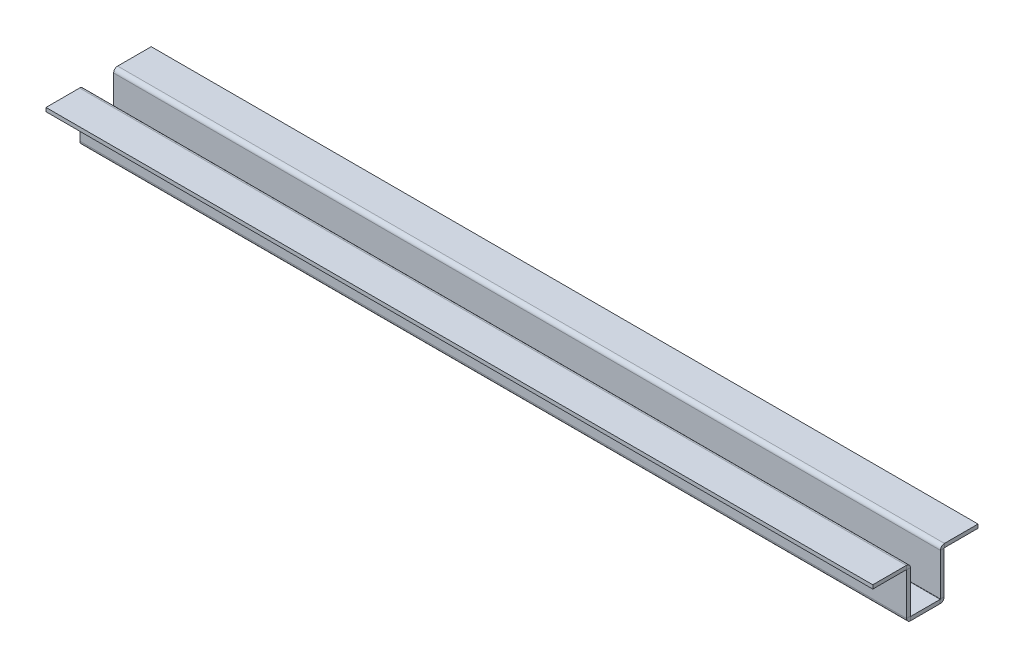
ISO-10303-21;
HEADER;
FILE_DESCRIPTION(('STEP AP214'),'2;1');
FILE_NAME('part.step','',(''),(''),'','','');
FILE_SCHEMA(('AUTOMOTIVE_DESIGN { 1 0 10303 214 1 1 1 1 }'));
ENDSEC;
DATA;
#1=APPLICATION_CONTEXT('core data for automotive mechanical design processes');
#2=APPLICATION_PROTOCOL_DEFINITION('international standard','automotive_design',2000,#1);
#3=PRODUCT_CONTEXT('',#1,'mechanical');
#4=PRODUCT('Part','Part','',(#3));
#5=PRODUCT_RELATED_PRODUCT_CATEGORY('part','',(#4));
#6=PRODUCT_DEFINITION_FORMATION('','',#4);
#7=PRODUCT_DEFINITION_CONTEXT('part definition',#1,'design');
#8=PRODUCT_DEFINITION('design','',#6,#7);
#9=PRODUCT_DEFINITION_SHAPE('','',#8);
#10=(LENGTH_UNIT() NAMED_UNIT(*) SI_UNIT(.MILLI.,.METRE.));
#11=(NAMED_UNIT(*) PLANE_ANGLE_UNIT() SI_UNIT($,.RADIAN.));
#12=(NAMED_UNIT(*) SI_UNIT($,.STERADIAN.) SOLID_ANGLE_UNIT());
#13=UNCERTAINTY_MEASURE_WITH_UNIT(LENGTH_MEASURE(1.E-05),#10,'distance_accuracy_value','');
#14=(GEOMETRIC_REPRESENTATION_CONTEXT(3) GLOBAL_UNCERTAINTY_ASSIGNED_CONTEXT((#13)) GLOBAL_UNIT_ASSIGNED_CONTEXT((#10,
#11,#12)) REPRESENTATION_CONTEXT('',''));
#15=CARTESIAN_POINT('',(0.,0.,0.));
#16=DIRECTION('',(0.,0.,1.));
#17=DIRECTION('',(1.,0.,0.));
#18=AXIS2_PLACEMENT_3D('',#15,#16,#17);
#19=CARTESIAN_POINT('',(-31.518813398457,-920.54389710299,748.999999999992));
#20=DIRECTION('',(0.,0.,1.));
#21=DIRECTION('',(1.,0.,0.));
#22=AXIS2_PLACEMENT_3D('',#19,#20,#21);
#23=PLANE('',#22);
#24=DIRECTION('',(1.,0.,0.));
#25=VECTOR('',#24,1.);
#26=CARTESIAN_POINT('',(-1.88320096237854E-12,-260.,748.999999999993));
#27=LINE('',#26,#25);
#28=CARTESIAN_POINT('',(14.9999999999995,-260.,748.999999999993));
#29=VERTEX_POINT('',#28);
#30=CARTESIAN_POINT('',(345.000000000001,-260.000000000003,749.));
#31=VERTEX_POINT('',#30);
#32=EDGE_CURVE('E450',#29,#31,#27,.T.);
#33=ORIENTED_EDGE('',*,*,#32,.T.);
#34=DIRECTION('',(0.,1.,0.));
#35=VECTOR('',#34,1.);
#36=CARTESIAN_POINT('',(344.999999999996,-920.54389710299,749.));
#37=LINE('',#36,#35);
#38=CARTESIAN_POINT('',(345.000000000001,-261.500000000003,749.));
#39=VERTEX_POINT('',#38);
#40=EDGE_CURVE('E438',#39,#31,#37,.T.);
#41=ORIENTED_EDGE('',*,*,#40,.F.);
#42=DIRECTION('',(1.,0.,0.));
#43=VECTOR('',#42,1.);
#44=CARTESIAN_POINT('',(-31.5188133984515,-261.5,748.999999999992));
#45=LINE('',#44,#43);
#46=CARTESIAN_POINT('',(14.9999999999995,-261.500000000004,748.999999999993));
#47=VERTEX_POINT('',#46);
#48=EDGE_CURVE('E12',#47,#39,#45,.T.);
#49=ORIENTED_EDGE('',*,*,#48,.F.);
#50=DIRECTION('',(0.,1.,0.));
#51=VECTOR('',#50,1.);
#52=CARTESIAN_POINT('',(14.9999999999939,-920.543897102993,748.999999999993));
#53=LINE('',#52,#51);
#54=EDGE_CURVE('E447',#47,#29,#53,.T.);
#55=ORIENTED_EDGE('',*,*,#54,.T.);
#56=EDGE_LOOP('',(#33,#41,#49,#55));
#57=FACE_BOUND('',#56,.T.);
#58=ADVANCED_FACE('F54',(#57),#23,.F.);
#59=CARTESIAN_POINT('',(15.0000000000086,-920.543897102994,15.7071067811791));
#60=DIRECTION('',(-1.,0.,0.));
#61=DIRECTION('',(0.,0.,1.));
#62=AXIS2_PLACEMENT_3D('',#59,#60,#61);
#63=PLANE('',#62);
#64=DIRECTION('',(0.,1.,0.));
#65=VECTOR('',#64,1.);
#66=CARTESIAN_POINT('',(14.9999999999937,-920.543897102994,762.399999999997));
#67=LINE('',#66,#65);
#68=CARTESIAN_POINT('',(14.9999999999992,-261.500000000004,762.399999999997));
#69=VERTEX_POINT('',#68);
#70=CARTESIAN_POINT('',(14.9999999999991,-260.000000000001,762.399999999997));
#71=VERTEX_POINT('',#70);
#72=EDGE_CURVE('E444',#69,#71,#67,.T.);
#73=ORIENTED_EDGE('',*,*,#72,.T.);
#74=DIRECTION('',(0.,0.,1.));
#75=VECTOR('',#74,1.);
#76=CARTESIAN_POINT('',(15.0000000000145,-260.,-6.66133814775094E-12));
#77=LINE('',#76,#75);
#78=EDGE_CURVE('E439',#71,#29,#77,.F.);
#79=ORIENTED_EDGE('',*,*,#78,.T.);
#80=ORIENTED_EDGE('',*,*,#54,.F.);
#81=DIRECTION('',(0.,0.,1.));
#82=VECTOR('',#81,1.);
#83=CARTESIAN_POINT('',(15.0000000000142,-261.500000000004,15.7071067811791));
#84=LINE('',#83,#82);
#85=EDGE_CURVE('E432',#47,#69,#84,.T.);
#86=ORIENTED_EDGE('',*,*,#85,.T.);
#87=EDGE_LOOP('',(#73,#79,#80,#86));
#88=FACE_BOUND('',#87,.T.);
#89=ADVANCED_FACE('F646',(#88),#63,.T.);
#90=CARTESIAN_POINT('',(14.9999999999987,-260.,790.999999999993));
#91=DIRECTION('',(0.,1.,0.));
#92=DIRECTION('',(-1.,0.,0.));
#93=AXIS2_PLACEMENT_3D('',#90,#91,#92);
#94=PLANE('',#93);
#95=DIRECTION('',(-1.,0.,0.));
#96=VECTOR('',#95,1.);
#97=CARTESIAN_POINT('',(14.9999999999993,-260.,762.399999999997));
#98=LINE('',#97,#96);
#99=CARTESIAN_POINT('',(345.000000000001,-260.000000000003,762.4));
#100=VERTEX_POINT('',#99);
#101=EDGE_CURVE('E110',#100,#71,#98,.T.);
#102=ORIENTED_EDGE('',*,*,#101,.F.);
#103=DIRECTION('',(0.,0.,1.));
#104=VECTOR('',#103,1.);
#105=CARTESIAN_POINT('',(345.000000000016,-260.000000000003,0.));
#106=LINE('',#105,#104);
#107=EDGE_CURVE('E102',#31,#100,#106,.T.);
#108=ORIENTED_EDGE('',*,*,#107,.F.);
#109=ORIENTED_EDGE('',*,*,#32,.F.);
#110=ORIENTED_EDGE('',*,*,#78,.F.);
#111=EDGE_LOOP('',(#102,#108,#109,#110));
#112=FACE_BOUND('',#111,.T.);
#113=ADVANCED_FACE('F652',(#112),#94,.T.);
#114=CARTESIAN_POINT('',(345.00000000001,-920.54389710299,15.7071067811856));
#115=DIRECTION('',(1.,0.,0.));
#116=DIRECTION('',(0.,0.,-1.));
#117=AXIS2_PLACEMENT_3D('',#114,#115,#116);
#118=PLANE('',#117);
#119=ORIENTED_EDGE('',*,*,#40,.T.);
#120=ORIENTED_EDGE('',*,*,#107,.T.);
#121=DIRECTION('',(0.,1.,0.));
#122=VECTOR('',#121,1.);
#123=CARTESIAN_POINT('',(344.999999999995,-920.54389710299,762.4));
#124=LINE('',#123,#122);
#125=CARTESIAN_POINT('',(345.000000000001,-261.5,762.4));
#126=VERTEX_POINT('',#125);
#127=EDGE_CURVE('E280',#126,#100,#124,.T.);
#128=ORIENTED_EDGE('',*,*,#127,.F.);
#129=DIRECTION('',(0.,0.,-1.));
#130=VECTOR('',#129,1.);
#131=CARTESIAN_POINT('',(345.000000000016,-261.500000000003,15.7071067811856));
#132=LINE('',#131,#130);
#133=EDGE_CURVE('E67',#126,#39,#132,.T.);
#134=ORIENTED_EDGE('',*,*,#133,.T.);
#135=EDGE_LOOP('',(#119,#120,#128,#134));
#136=FACE_BOUND('',#135,.T.);
#137=ADVANCED_FACE('F663',(#136),#118,.T.);
#138=CARTESIAN_POINT('',(1.30834004829127E-11,-261.5,-6.99440505513849E-12));
#139=DIRECTION('',(0.,-1.,0.));
#140=DIRECTION('',(1.,0.,0.));
#141=AXIS2_PLACEMENT_3D('',#138,#139,#140);
#142=PLANE('',#141);
#143=DIRECTION('',(1.,0.,0.));
#144=VECTOR('',#143,1.);
#145=CARTESIAN_POINT('',(14.9999999999993,-261.5,762.399999999997));
#146=LINE('',#145,#144);
#147=EDGE_CURVE('E59',#69,#126,#146,.T.);
#148=ORIENTED_EDGE('',*,*,#147,.F.);
#149=ORIENTED_EDGE('',*,*,#85,.F.);
#150=ORIENTED_EDGE('',*,*,#48,.T.);
#151=ORIENTED_EDGE('',*,*,#133,.F.);
#152=EDGE_LOOP('',(#148,#149,#150,#151));
#153=FACE_BOUND('',#152,.T.);
#154=ADVANCED_FACE('F57',(#153),#142,.T.);
#155=CARTESIAN_POINT('',(-31.5188133984564,-920.543897102991,791.000000000006));
#156=DIRECTION('',(0.,0.,-1.));
#157=DIRECTION('',(-1.,0.,0.));
#158=AXIS2_PLACEMENT_3D('',#155,#156,#157);
#159=PLANE('',#158);
#160=DIRECTION('',(1.,0.,0.));
#161=VECTOR('',#160,1.);
#162=CARTESIAN_POINT('',(-1.57900314343364E-12,-260.,791.000000000005));
#163=LINE('',#162,#161);
#164=CARTESIAN_POINT('',(345.000000000001,-260.000000000003,790.999999999993));
#165=VERTEX_POINT('',#164);
#166=CARTESIAN_POINT('',(14.9999999999998,-260.,791.000000000004));
#167=VERTEX_POINT('',#166);
#168=EDGE_CURVE('E362',#165,#167,#163,.F.);
#169=ORIENTED_EDGE('',*,*,#168,.T.);
#170=DIRECTION('',(0.,1.,0.));
#171=VECTOR('',#170,1.);
#172=CARTESIAN_POINT('',(14.9999999999945,-920.543897102995,791.000000000004));
#173=LINE('',#172,#171);
#174=CARTESIAN_POINT('',(14.9999999999998,-261.5,791.000000000004));
#175=VERTEX_POINT('',#174);
#176=EDGE_CURVE('E693',#175,#167,#173,.T.);
#177=ORIENTED_EDGE('',*,*,#176,.F.);
#178=DIRECTION('',(-1.,0.,0.));
#179=VECTOR('',#178,1.);
#180=CARTESIAN_POINT('',(-31.5188133984511,-261.5,791.000000000006));
#181=LINE('',#180,#179);
#182=CARTESIAN_POINT('',(345.000000000001,-261.5,790.999999999993));
#183=VERTEX_POINT('',#182);
#184=EDGE_CURVE('E120',#183,#175,#181,.T.);
#185=ORIENTED_EDGE('',*,*,#184,.F.);
#186=DIRECTION('',(0.,1.,0.));
#187=VECTOR('',#186,1.);
#188=CARTESIAN_POINT('',(344.999999999996,-920.543897102991,790.999999999992));
#189=LINE('',#188,#187);
#190=EDGE_CURVE('E707',#183,#165,#189,.T.);
#191=ORIENTED_EDGE('',*,*,#190,.T.);
#192=EDGE_LOOP('',(#169,#177,#185,#191));
#193=FACE_BOUND('',#192,.T.);
#194=ADVANCED_FACE('F669',(#193),#159,.F.);
#195=CARTESIAN_POINT('',(344.999999999969,-920.543897102991,15.7071067811785));
#196=DIRECTION('',(1.,0.,0.));
#197=DIRECTION('',(0.,0.,-1.));
#198=AXIS2_PLACEMENT_3D('',#195,#196,#197);
#199=PLANE('',#198);
#200=DIRECTION('',(0.,1.,0.));
#201=VECTOR('',#200,1.);
#202=CARTESIAN_POINT('',(344.999999999996,-920.543897102991,777.599999999996));
#203=LINE('',#202,#201);
#204=CARTESIAN_POINT('',(345.000000000001,-261.5,777.599999999996));
#205=VERTEX_POINT('',#204);
#206=CARTESIAN_POINT('',(345.000000000001,-260.000000000003,777.599999999996));
#207=VERTEX_POINT('',#206);
#208=EDGE_CURVE('E705',#205,#207,#203,.T.);
#209=ORIENTED_EDGE('',*,*,#208,.T.);
#210=DIRECTION('',(0.,0.,1.));
#211=VECTOR('',#210,1.);
#212=CARTESIAN_POINT('',(344.999999999973,-260.000000000003,-7.105427357601E-12));
#213=LINE('',#212,#211);
#214=EDGE_CURVE('E701',#207,#165,#213,.T.);
#215=ORIENTED_EDGE('',*,*,#214,.T.);
#216=ORIENTED_EDGE('',*,*,#190,.F.);
#217=DIRECTION('',(0.,0.,-1.));
#218=VECTOR('',#217,1.);
#219=CARTESIAN_POINT('',(344.999999999974,-261.5,15.7071067811785));
#220=LINE('',#219,#218);
#221=EDGE_CURVE('E697',#183,#205,#220,.T.);
#222=ORIENTED_EDGE('',*,*,#221,.T.);
#223=EDGE_LOOP('',(#209,#215,#216,#222));
#224=FACE_BOUND('',#223,.T.);
#225=ADVANCED_FACE('F719',(#224),#199,.T.);
#226=CARTESIAN_POINT('',(14.9999999999998,-260.,791.000000000004));
#227=DIRECTION('',(0.,1.,0.));
#228=DIRECTION('',(-1.,0.,0.));
#229=AXIS2_PLACEMENT_3D('',#226,#227,#228);
#230=PLANE('',#229);
#231=DIRECTION('',(1.,0.,0.));
#232=VECTOR('',#231,1.);
#233=CARTESIAN_POINT('',(345.000000000001,-260.000000000003,777.599999999996));
#234=LINE('',#233,#232);
#235=CARTESIAN_POINT('',(14.9999999999993,-260.,777.600000000004));
#236=VERTEX_POINT('',#235);
#237=EDGE_CURVE('E153',#236,#207,#234,.T.);
#238=ORIENTED_EDGE('',*,*,#237,.F.);
#239=DIRECTION('',(0.,0.,1.));
#240=VECTOR('',#239,1.);
#241=CARTESIAN_POINT('',(14.9999999999717,-260.,4.44089209850063E-12));
#242=LINE('',#241,#240);
#243=EDGE_CURVE('E146',#167,#236,#242,.F.);
#244=ORIENTED_EDGE('',*,*,#243,.F.);
#245=ORIENTED_EDGE('',*,*,#168,.F.);
#246=ORIENTED_EDGE('',*,*,#214,.F.);
#247=EDGE_LOOP('',(#238,#244,#245,#246));
#248=FACE_BOUND('',#247,.T.);
#249=ADVANCED_FACE('F743',(#248),#230,.T.);
#250=CARTESIAN_POINT('',(14.9999999999669,-920.543897102995,15.7071067811902));
#251=DIRECTION('',(-1.,0.,0.));
#252=DIRECTION('',(0.,0.,1.));
#253=AXIS2_PLACEMENT_3D('',#250,#251,#252);
#254=PLANE('',#253);
#255=ORIENTED_EDGE('',*,*,#176,.T.);
#256=ORIENTED_EDGE('',*,*,#243,.T.);
#257=DIRECTION('',(0.,1.,0.));
#258=VECTOR('',#257,1.);
#259=CARTESIAN_POINT('',(14.999999999994,-920.543897102995,777.600000000004));
#260=LINE('',#259,#258);
#261=CARTESIAN_POINT('',(14.9999999999993,-261.500000000004,777.600000000004));
#262=VERTEX_POINT('',#261);
#263=EDGE_CURVE('E363',#262,#236,#260,.T.);
#264=ORIENTED_EDGE('',*,*,#263,.F.);
#265=DIRECTION('',(0.,0.,1.));
#266=VECTOR('',#265,1.);
#267=CARTESIAN_POINT('',(14.9999999999722,-261.500000000001,15.7071067811902));
#268=LINE('',#267,#266);
#269=EDGE_CURVE('E689',#262,#175,#268,.T.);
#270=ORIENTED_EDGE('',*,*,#269,.T.);
#271=EDGE_LOOP('',(#255,#256,#264,#270));
#272=FACE_BOUND('',#271,.T.);
#273=ADVANCED_FACE('F716',(#272),#254,.T.);
#274=CARTESIAN_POINT('',(-2.97451930984385E-11,-261.5,4.88498130835069E-12));
#275=DIRECTION('',(0.,-1.,0.));
#276=DIRECTION('',(1.,0.,0.));
#277=AXIS2_PLACEMENT_3D('',#274,#275,#276);
#278=PLANE('',#277);
#279=DIRECTION('',(-1.,0.,0.));
#280=VECTOR('',#279,1.);
#281=CARTESIAN_POINT('',(345.000000000001,-261.500000000003,777.599999999996));
#282=LINE('',#281,#280);
#283=EDGE_CURVE('E326',#205,#262,#282,.T.);
#284=ORIENTED_EDGE('',*,*,#283,.F.);
#285=ORIENTED_EDGE('',*,*,#221,.F.);
#286=ORIENTED_EDGE('',*,*,#184,.T.);
#287=ORIENTED_EDGE('',*,*,#269,.F.);
#288=EDGE_LOOP('',(#284,#285,#286,#287));
#289=FACE_BOUND('',#288,.T.);
#290=ADVANCED_FACE('F657',(#289),#278,.T.);
#291=CARTESIAN_POINT('',(14.9999999999886,-278.500000000005,115.14528071595));
#292=DIRECTION('',(1.,0.,0.));
#293=DIRECTION('',(0.,-1.,0.));
#294=AXIS2_PLACEMENT_3D('',#291,#292,#293);
#295=PLANE('',#294);
#296=DIRECTION('',(0.,0.,1.));
#297=VECTOR('',#296,1.);
#298=CARTESIAN_POINT('',(14.9999999999886,-278.400000000003,115.14528071595));
#299=LINE('',#298,#297);
#300=CARTESIAN_POINT('',(14.9999999999991,-278.400000000003,776.000000000004));
#301=VERTEX_POINT('',#300);
#302=CARTESIAN_POINT('',(14.9999999999991,-278.400000000003,777.500000000003));
#303=VERTEX_POINT('',#302);
#304=EDGE_CURVE('E603',#301,#303,#299,.T.);
#305=ORIENTED_EDGE('',*,*,#304,.T.);
#306=DIRECTION('',(0.,1.,0.));
#307=VECTOR('',#306,1.);
#308=CARTESIAN_POINT('',(14.9999999999991,-278.500000000005,777.500000000005));
#309=LINE('',#308,#307);
#310=CARTESIAN_POINT('',(14.9999999999995,-261.600000000004,777.500000000005));
#311=VERTEX_POINT('',#310);
#312=EDGE_CURVE('E609',#303,#311,#309,.T.);
#313=ORIENTED_EDGE('',*,*,#312,.T.);
#314=DIRECTION('',(0.,0.,1.));
#315=VECTOR('',#314,1.);
#316=CARTESIAN_POINT('',(14.9999999999886,-261.600000000004,115.14528071595));
#317=LINE('',#316,#315);
#318=CARTESIAN_POINT('',(14.9999999999994,-261.600000000004,776.000000000005));
#319=VERTEX_POINT('',#318);
#320=EDGE_CURVE('E601',#319,#311,#317,.T.);
#321=ORIENTED_EDGE('',*,*,#320,.F.);
#322=DIRECTION('',(0.,1.,0.));
#323=VECTOR('',#322,1.);
#324=CARTESIAN_POINT('',(14.9999999999991,-278.500000000005,776.000000000005));
#325=LINE('',#324,#323);
#326=EDGE_CURVE('E320',#301,#319,#325,.T.);
#327=ORIENTED_EDGE('',*,*,#326,.F.);
#328=EDGE_LOOP('',(#305,#313,#321,#327));
#329=FACE_BOUND('',#328,.T.);
#330=ADVANCED_FACE('F627',(#329),#295,.F.);
#331=CARTESIAN_POINT('',(-31.5188133984514,-280.000000000005,777.500000000006));
#332=DIRECTION('',(0.,0.,-1.));
#333=DIRECTION('',(-1.,0.,0.));
#334=AXIS2_PLACEMENT_3D('',#331,#332,#333);
#335=PLANE('',#334);
#336=DIRECTION('',(0.,1.,0.));
#337=VECTOR('',#336,1.);
#338=CARTESIAN_POINT('',(345.000000000001,-280.000000000004,777.5));
#339=LINE('',#338,#337);
#340=CARTESIAN_POINT('',(345.000000000001,-261.600000000003,777.5));
#341=VERTEX_POINT('',#340);
#342=CARTESIAN_POINT('',(345.000000000001,-278.4,777.5));
#343=VERTEX_POINT('',#342);
#344=EDGE_CURVE('E334',#341,#343,#339,.F.);
#345=ORIENTED_EDGE('',*,*,#344,.F.);
#346=DIRECTION('',(-1.,0.,0.));
#347=VECTOR('',#346,1.);
#348=CARTESIAN_POINT('',(345.000000000001,-261.600000000003,777.5));
#349=LINE('',#348,#347);
#350=EDGE_CURVE('E347',#341,#311,#349,.T.);
#351=ORIENTED_EDGE('',*,*,#350,.T.);
#352=ORIENTED_EDGE('',*,*,#312,.F.);
#353=DIRECTION('',(1.,0.,0.));
#354=VECTOR('',#353,1.);
#355=CARTESIAN_POINT('',(14.9999999999993,-278.400000000003,777.500000000005));
#356=LINE('',#355,#354);
#357=EDGE_CURVE('E342',#303,#343,#356,.T.);
#358=ORIENTED_EDGE('',*,*,#357,.T.);
#359=EDGE_LOOP('',(#345,#351,#352,#358));
#360=FACE_BOUND('',#359,.T.);
#361=ADVANCED_FACE('F621',(#360),#335,.F.);
#362=CARTESIAN_POINT('',(344.999999999991,-278.500000000005,115.145280715945));
#363=DIRECTION('',(-1.,0.,0.));
#364=DIRECTION('',(0.,1.,0.));
#365=AXIS2_PLACEMENT_3D('',#362,#363,#364);
#366=PLANE('',#365);
#367=DIRECTION('',(0.,0.,1.));
#368=VECTOR('',#367,1.);
#369=CARTESIAN_POINT('',(344.999999999991,-261.600000000003,115.145280715945));
#370=LINE('',#369,#368);
#371=CARTESIAN_POINT('',(345.000000000001,-261.600000000003,775.999999999996));
#372=VERTEX_POINT('',#371);
#373=EDGE_CURVE('E338',#372,#341,#370,.T.);
#374=ORIENTED_EDGE('',*,*,#373,.T.);
#375=ORIENTED_EDGE('',*,*,#344,.T.);
#376=DIRECTION('',(0.,0.,1.));
#377=VECTOR('',#376,1.);
#378=CARTESIAN_POINT('',(344.999999999991,-278.4,115.145280715945));
#379=LINE('',#378,#377);
#380=CARTESIAN_POINT('',(345.000000000001,-278.4,776.));
#381=VERTEX_POINT('',#380);
#382=EDGE_CURVE('E562',#381,#343,#379,.T.);
#383=ORIENTED_EDGE('',*,*,#382,.F.);
#384=DIRECTION('',(0.,1.,0.));
#385=VECTOR('',#384,1.);
#386=CARTESIAN_POINT('',(345.000000000001,-278.500000000004,776.));
#387=LINE('',#386,#385);
#388=EDGE_CURVE('E327',#372,#381,#387,.F.);
#389=ORIENTED_EDGE('',*,*,#388,.F.);
#390=EDGE_LOOP('',(#374,#375,#383,#389));
#391=FACE_BOUND('',#390,.T.);
#392=ADVANCED_FACE('F590',(#391),#366,.F.);
#393=CARTESIAN_POINT('',(-31.5188133984515,-278.500000000005,776.000000000006));
#394=DIRECTION('',(0.,0.,-1.));
#395=DIRECTION('',(-1.,0.,0.));
#396=AXIS2_PLACEMENT_3D('',#393,#394,#395);
#397=PLANE('',#396);
#398=DIRECTION('',(-1.,0.,0.));
#399=VECTOR('',#398,1.);
#400=CARTESIAN_POINT('',(345.000000000001,-261.600000000003,776.));
#401=LINE('',#400,#399);
#402=EDGE_CURVE('E575',#372,#319,#401,.T.);
#403=ORIENTED_EDGE('',*,*,#402,.F.);
#404=ORIENTED_EDGE('',*,*,#388,.T.);
#405=DIRECTION('',(1.,0.,0.));
#406=VECTOR('',#405,1.);
#407=CARTESIAN_POINT('',(14.9999999999993,-278.400000000003,776.000000000005));
#408=LINE('',#407,#406);
#409=EDGE_CURVE('E568',#301,#381,#408,.T.);
#410=ORIENTED_EDGE('',*,*,#409,.F.);
#411=ORIENTED_EDGE('',*,*,#326,.T.);
#412=EDGE_LOOP('',(#403,#404,#410,#411));
#413=FACE_BOUND('',#412,.T.);
#414=ADVANCED_FACE('F594',(#413),#397,.T.);
#415=CARTESIAN_POINT('',(14.999999999985,381.921804606723,2.4980018054066E-12));
#416=DIRECTION('',(-1.,0.,0.));
#417=DIRECTION('',(0.,0.,1.));
#418=AXIS2_PLACEMENT_3D('',#415,#416,#417);
#419=PLANE('',#418);
#420=DIRECTION('',(0.,0.,1.));
#421=VECTOR('',#420,1.);
#422=CARTESIAN_POINT('',(14.9999999999932,-280.000000000004,2.44249065417534E-12));
#423=LINE('',#422,#421);
#424=CARTESIAN_POINT('',(14.999999999999,-280.000000000005,764.099999999996));
#425=VERTEX_POINT('',#424);
#426=CARTESIAN_POINT('',(14.9999999999991,-280.000000000003,775.900000000004));
#427=VERTEX_POINT('',#426);
#428=EDGE_CURVE('E417',#425,#427,#423,.T.);
#429=ORIENTED_EDGE('',*,*,#428,.T.);
#430=DIRECTION('',(0.,-1.,0.));
#431=VECTOR('',#430,1.);
#432=CARTESIAN_POINT('',(14.9999999999909,381.921804606723,775.900000000004));
#433=LINE('',#432,#431);
#434=CARTESIAN_POINT('',(14.9999999999991,-278.500000000003,775.900000000004));
#435=VERTEX_POINT('',#434);
#436=EDGE_CURVE('E524',#435,#427,#433,.T.);
#437=ORIENTED_EDGE('',*,*,#436,.F.);
#438=DIRECTION('',(0.,0.,1.));
#439=VECTOR('',#438,1.);
#440=CARTESIAN_POINT('',(14.9999999999932,-278.500000000005,2.44249065417534E-12));
#441=LINE('',#440,#439);
#442=CARTESIAN_POINT('',(14.999999999999,-278.500000000006,764.100000000001));
#443=VERTEX_POINT('',#442);
#444=EDGE_CURVE('E541',#435,#443,#441,.F.);
#445=ORIENTED_EDGE('',*,*,#444,.T.);
#446=DIRECTION('',(0.,-1.,0.));
#447=VECTOR('',#446,1.);
#448=CARTESIAN_POINT('',(14.9999999999908,381.921804606723,764.100000000001));
#449=LINE('',#448,#447);
#450=EDGE_CURVE('E534',#443,#425,#449,.T.);
#451=ORIENTED_EDGE('',*,*,#450,.T.);
#452=EDGE_LOOP('',(#429,#437,#445,#451));
#453=FACE_BOUND('',#452,.T.);
#454=ADVANCED_FACE('F635',(#453),#419,.T.);
#455=CARTESIAN_POINT('',(344.999999999987,381.921804606728,0.));
#456=DIRECTION('',(-1.,0.,0.));
#457=DIRECTION('',(0.,0.,1.));
#458=AXIS2_PLACEMENT_3D('',#455,#456,#457);
#459=PLANE('',#458);
#460=DIRECTION('',(0.,-1.,0.));
#461=VECTOR('',#460,1.);
#462=CARTESIAN_POINT('',(344.999999999993,381.921804606728,775.9));
#463=LINE('',#462,#461);
#464=CARTESIAN_POINT('',(345.000000000002,-278.5,775.9));
#465=VERTEX_POINT('',#464);
#466=CARTESIAN_POINT('',(345.000000000002,-280.,775.9));
#467=VERTEX_POINT('',#466);
#468=EDGE_CURVE('E527',#465,#467,#463,.T.);
#469=ORIENTED_EDGE('',*,*,#468,.T.);
#470=DIRECTION('',(0.,0.,1.));
#471=VECTOR('',#470,1.);
#472=CARTESIAN_POINT('',(345.000000000001,-280.,762.5));
#473=LINE('',#472,#471);
#474=CARTESIAN_POINT('',(345.000000000001,-280.,764.1));
#475=VERTEX_POINT('',#474);
#476=EDGE_CURVE('E413',#467,#475,#473,.F.);
#477=ORIENTED_EDGE('',*,*,#476,.T.);
#478=DIRECTION('',(0.,-1.,0.));
#479=VECTOR('',#478,1.);
#480=CARTESIAN_POINT('',(344.999999999993,381.921804606728,764.1));
#481=LINE('',#480,#479);
#482=CARTESIAN_POINT('',(345.000000000001,-278.500000000003,764.1));
#483=VERTEX_POINT('',#482);
#484=EDGE_CURVE('E531',#483,#475,#481,.T.);
#485=ORIENTED_EDGE('',*,*,#484,.F.);
#486=DIRECTION('',(0.,0.,1.));
#487=VECTOR('',#486,1.);
#488=CARTESIAN_POINT('',(344.999999999996,-278.5,0.));
#489=LINE('',#488,#487);
#490=EDGE_CURVE('E544',#465,#483,#489,.F.);
#491=ORIENTED_EDGE('',*,*,#490,.F.);
#492=EDGE_LOOP('',(#469,#477,#485,#491));
#493=FACE_BOUND('',#492,.T.);
#494=ADVANCED_FACE('F565',(#493),#459,.F.);
#495=CARTESIAN_POINT('',(-31.5188133984515,-278.500000000005,764.000000000003));
#496=DIRECTION('',(0.,1.,0.));
#497=DIRECTION('',(-1.,0.,0.));
#498=AXIS2_PLACEMENT_3D('',#495,#496,#497);
#499=PLANE('',#498);
#500=ORIENTED_EDGE('',*,*,#444,.F.);
#501=DIRECTION('',(1.,0.,0.));
#502=VECTOR('',#501,1.);
#503=CARTESIAN_POINT('',(14.999999999999,-278.500000000004,775.900000000004));
#504=LINE('',#503,#502);
#505=EDGE_CURVE('E536',#435,#465,#504,.T.);
#506=ORIENTED_EDGE('',*,*,#505,.T.);
#507=ORIENTED_EDGE('',*,*,#490,.T.);
#508=DIRECTION('',(1.,0.,0.));
#509=VECTOR('',#508,1.);
#510=CARTESIAN_POINT('',(14.9999999999991,-278.500000000004,764.100000000001));
#511=LINE('',#510,#509);
#512=EDGE_CURVE('E498',#443,#483,#511,.T.);
#513=ORIENTED_EDGE('',*,*,#512,.F.);
#514=EDGE_LOOP('',(#500,#506,#507,#513));
#515=FACE_BOUND('',#514,.T.);
#516=ADVANCED_FACE('F633',(#515),#499,.T.);
#517=CARTESIAN_POINT('',(-31.5188133984515,-280.000000000005,762.500000000003));
#518=DIRECTION('',(0.,1.,0.));
#519=DIRECTION('',(-1.,0.,0.));
#520=AXIS2_PLACEMENT_3D('',#517,#518,#519);
#521=PLANE('',#520);
#522=DIRECTION('',(1.,0.,0.));
#523=VECTOR('',#522,1.);
#524=CARTESIAN_POINT('',(14.9999999999991,-280.000000000004,775.900000000004));
#525=LINE('',#524,#523);
#526=EDGE_CURVE('E422',#427,#467,#525,.T.);
#527=ORIENTED_EDGE('',*,*,#526,.F.);
#528=ORIENTED_EDGE('',*,*,#428,.F.);
#529=DIRECTION('',(1.,0.,0.));
#530=VECTOR('',#529,1.);
#531=CARTESIAN_POINT('',(14.9999999999991,-280.000000000004,764.100000000001));
#532=LINE('',#531,#530);
#533=EDGE_CURVE('E328',#425,#475,#532,.T.);
#534=ORIENTED_EDGE('',*,*,#533,.T.);
#535=ORIENTED_EDGE('',*,*,#476,.F.);
#536=EDGE_LOOP('',(#527,#528,#534,#535));
#537=FACE_BOUND('',#536,.T.);
#538=ADVANCED_FACE('F566',(#537),#521,.F.);
#539=CARTESIAN_POINT('',(-31.5188133984517,-261.500000000005,764.));
#540=DIRECTION('',(0.,0.,1.));
#541=DIRECTION('',(1.,0.,0.));
#542=AXIS2_PLACEMENT_3D('',#539,#540,#541);
#543=PLANE('',#542);
#544=DIRECTION('',(1.,0.,0.));
#545=VECTOR('',#544,1.);
#546=CARTESIAN_POINT('',(14.999999999999,-261.6,764.));
#547=LINE('',#546,#545);
#548=CARTESIAN_POINT('',(14.999999999999,-261.6,763.999999999996));
#549=VERTEX_POINT('',#548);
#550=CARTESIAN_POINT('',(345.000000000001,-261.6,764.));
#551=VERTEX_POINT('',#550);
#552=EDGE_CURVE('E260',#549,#551,#547,.T.);
#553=ORIENTED_EDGE('',*,*,#552,.F.);
#554=DIRECTION('',(0.,1.,0.));
#555=VECTOR('',#554,1.);
#556=CARTESIAN_POINT('',(14.999999999999,-261.500000000005,764.));
#557=LINE('',#556,#555);
#558=CARTESIAN_POINT('',(14.999999999999,-278.400000000005,764.000000000001));
#559=VERTEX_POINT('',#558);
#560=EDGE_CURVE('E271',#549,#559,#557,.F.);
#561=ORIENTED_EDGE('',*,*,#560,.T.);
#562=DIRECTION('',(1.,0.,0.));
#563=VECTOR('',#562,1.);
#564=CARTESIAN_POINT('',(14.999999999999,-278.400000000005,764.));
#565=LINE('',#564,#563);
#566=CARTESIAN_POINT('',(345.000000000001,-278.400000000003,764.));
#567=VERTEX_POINT('',#566);
#568=EDGE_CURVE('E299',#559,#567,#565,.T.);
#569=ORIENTED_EDGE('',*,*,#568,.T.);
#570=DIRECTION('',(0.,1.,0.));
#571=VECTOR('',#570,1.);
#572=CARTESIAN_POINT('',(345.000000000001,-261.500000000005,764.));
#573=LINE('',#572,#571);
#574=EDGE_CURVE('E289',#567,#551,#573,.T.);
#575=ORIENTED_EDGE('',*,*,#574,.T.);
#576=EDGE_LOOP('',(#553,#561,#569,#575));
#577=FACE_BOUND('',#576,.T.);
#578=ADVANCED_FACE('F297',(#577),#543,.T.);
#579=CARTESIAN_POINT('',(345.000000000001,-261.500000000005,1424.85471928405));
#580=DIRECTION('',(-1.,0.,0.));
#581=DIRECTION('',(0.,0.,1.));
#582=AXIS2_PLACEMENT_3D('',#579,#580,#581);
#583=PLANE('',#582);
#584=DIRECTION('',(0.,0.,-1.));
#585=VECTOR('',#584,1.);
#586=CARTESIAN_POINT('',(345.000000000001,-278.400000000003,1424.85471928405));
#587=LINE('',#586,#585);
#588=CARTESIAN_POINT('',(345.000000000001,-278.400000000003,762.5));
#589=VERTEX_POINT('',#588);
#590=EDGE_CURVE('E301',#567,#589,#587,.T.);
#591=ORIENTED_EDGE('',*,*,#590,.T.);
#592=DIRECTION('',(0.,1.,0.));
#593=VECTOR('',#592,1.);
#594=CARTESIAN_POINT('',(345.000000000001,-261.500000000005,762.5));
#595=LINE('',#594,#593);
#596=CARTESIAN_POINT('',(345.000000000001,-261.6,762.5));
#597=VERTEX_POINT('',#596);
#598=EDGE_CURVE('E292',#589,#597,#595,.T.);
#599=ORIENTED_EDGE('',*,*,#598,.T.);
#600=DIRECTION('',(0.,0.,-1.));
#601=VECTOR('',#600,1.);
#602=CARTESIAN_POINT('',(345.000000000001,-261.6,1424.85471928405));
#603=LINE('',#602,#601);
#604=EDGE_CURVE('E272',#551,#597,#603,.T.);
#605=ORIENTED_EDGE('',*,*,#604,.F.);
#606=ORIENTED_EDGE('',*,*,#574,.F.);
#607=EDGE_LOOP('',(#591,#599,#605,#606));
#608=FACE_BOUND('',#607,.T.);
#609=ADVANCED_FACE('F288',(#608),#583,.F.);
#610=CARTESIAN_POINT('',(-31.5188133984517,-261.500000000005,762.5));
#611=DIRECTION('',(0.,0.,1.));
#612=DIRECTION('',(1.,0.,0.));
#613=AXIS2_PLACEMENT_3D('',#610,#611,#612);
#614=PLANE('',#613);
#615=DIRECTION('',(0.,1.,0.));
#616=VECTOR('',#615,1.);
#617=CARTESIAN_POINT('',(14.999999999999,-261.500000000005,762.5));
#618=LINE('',#617,#616);
#619=CARTESIAN_POINT('',(14.999999999999,-261.6,762.5));
#620=VERTEX_POINT('',#619);
#621=CARTESIAN_POINT('',(14.999999999999,-278.400000000006,762.500000000001));
#622=VERTEX_POINT('',#621);
#623=EDGE_CURVE('E418',#620,#622,#618,.F.);
#624=ORIENTED_EDGE('',*,*,#623,.F.);
#625=DIRECTION('',(1.,0.,0.));
#626=VECTOR('',#625,1.);
#627=CARTESIAN_POINT('',(14.999999999999,-261.6,762.5));
#628=LINE('',#627,#626);
#629=EDGE_CURVE('E487',#620,#597,#628,.T.);
#630=ORIENTED_EDGE('',*,*,#629,.T.);
#631=ORIENTED_EDGE('',*,*,#598,.F.);
#632=DIRECTION('',(1.,0.,0.));
#633=VECTOR('',#632,1.);
#634=CARTESIAN_POINT('',(14.999999999999,-278.400000000005,762.5));
#635=LINE('',#634,#633);
#636=EDGE_CURVE('E295',#622,#589,#635,.T.);
#637=ORIENTED_EDGE('',*,*,#636,.F.);
#638=EDGE_LOOP('',(#624,#630,#631,#637));
#639=FACE_BOUND('',#638,.T.);
#640=ADVANCED_FACE('F485',(#639),#614,.F.);
#641=CARTESIAN_POINT('',(14.999999999999,-261.500000000005,1424.85471928405));
#642=DIRECTION('',(1.,0.,0.));
#643=DIRECTION('',(0.,0.,-1.));
#644=AXIS2_PLACEMENT_3D('',#641,#642,#643);
#645=PLANE('',#644);
#646=DIRECTION('',(0.,0.,-1.));
#647=VECTOR('',#646,1.);
#648=CARTESIAN_POINT('',(14.999999999999,-261.6,1424.85471928405));
#649=LINE('',#648,#647);
#650=EDGE_CURVE('E467',#549,#620,#649,.T.);
#651=ORIENTED_EDGE('',*,*,#650,.T.);
#652=ORIENTED_EDGE('',*,*,#623,.T.);
#653=DIRECTION('',(0.,0.,-1.));
#654=VECTOR('',#653,1.);
#655=CARTESIAN_POINT('',(14.999999999999,-278.400000000005,1424.85471928405));
#656=LINE('',#655,#654);
#657=EDGE_CURVE('E409',#559,#622,#656,.T.);
#658=ORIENTED_EDGE('',*,*,#657,.F.);
#659=ORIENTED_EDGE('',*,*,#560,.F.);
#660=EDGE_LOOP('',(#651,#652,#658,#659));
#661=FACE_BOUND('',#660,.T.);
#662=ADVANCED_FACE('F465',(#661),#645,.F.);
#663=CARTESIAN_POINT('',(345.000000000001,-278.400000000003,764.1));
#664=DIRECTION('',(1.,7.1371480154509E-13,0.));
#665=DIRECTION('',(-7.1371480154509E-13,1.,0.));
#666=AXIS2_PLACEMENT_3D('',#663,#664,#665);
#667=PLANE('',#666);
#668=ORIENTED_EDGE('',*,*,#590,.F.);
#669=CARTESIAN_POINT('',(345.000000000001,-278.400000000003,764.1));
#670=DIRECTION('',(1.,0.,0.));
#671=DIRECTION('',(0.,1.,0.));
#672=AXIS2_PLACEMENT_3D('',#669,#670,#671);
#673=CIRCLE('',#672,0.100000000000027);
#674=EDGE_CURVE('E483',#567,#483,#673,.F.);
#675=ORIENTED_EDGE('',*,*,#674,.T.);
#676=ORIENTED_EDGE('',*,*,#484,.T.);
#677=CARTESIAN_POINT('',(345.000000000001,-278.400000000003,764.1));
#678=DIRECTION('',(1.,0.,0.));
#679=DIRECTION('',(0.,1.,0.));
#680=AXIS2_PLACEMENT_3D('',#677,#678,#679);
#681=CIRCLE('',#680,1.59999999999986);
#682=EDGE_CURVE('E412',#589,#475,#681,.F.);
#683=ORIENTED_EDGE('',*,*,#682,.F.);
#684=EDGE_LOOP('',(#668,#675,#676,#683));
#685=FACE_BOUND('',#684,.T.);
#686=ADVANCED_FACE('F492',(#685),#667,.T.);
#687=CARTESIAN_POINT('',(14.999999999999,-278.400000000005,764.100000000001));
#688=DIRECTION('',(-1.,0.,0.));
#689=DIRECTION('',(0.,-1.,0.));
#690=AXIS2_PLACEMENT_3D('',#687,#688,#689);
#691=PLANE('',#690);
#692=ORIENTED_EDGE('',*,*,#450,.F.);
#693=CARTESIAN_POINT('',(14.999999999999,-278.400000000005,764.100000000001));
#694=DIRECTION('',(1.,0.,0.));
#695=DIRECTION('',(0.,1.,0.));
#696=AXIS2_PLACEMENT_3D('',#693,#694,#695);
#697=CIRCLE('',#696,0.100000000000027);
#698=EDGE_CURVE('E476',#443,#559,#697,.T.);
#699=ORIENTED_EDGE('',*,*,#698,.T.);
#700=ORIENTED_EDGE('',*,*,#657,.T.);
#701=CARTESIAN_POINT('',(14.999999999999,-278.400000000005,764.100000000001));
#702=DIRECTION('',(1.,0.,0.));
#703=DIRECTION('',(0.,1.,0.));
#704=AXIS2_PLACEMENT_3D('',#701,#702,#703);
#705=CIRCLE('',#704,1.59999999999986);
#706=EDGE_CURVE('E473',#425,#622,#705,.T.);
#707=ORIENTED_EDGE('',*,*,#706,.F.);
#708=EDGE_LOOP('',(#692,#699,#700,#707));
#709=FACE_BOUND('',#708,.T.);
#710=ADVANCED_FACE('F472',(#709),#691,.T.);
#711=CARTESIAN_POINT('',(-323.418749480586,-278.400000000008,764.100000000002));
#712=DIRECTION('',(1.,0.,0.));
#713=DIRECTION('',(0.,1.,0.));
#714=AXIS2_PLACEMENT_3D('',#711,#712,#713);
#715=CYLINDRICAL_SURFACE('',#714,1.59999999999986);
#716=ORIENTED_EDGE('',*,*,#706,.T.);
#717=ORIENTED_EDGE('',*,*,#636,.T.);
#718=ORIENTED_EDGE('',*,*,#682,.T.);
#719=ORIENTED_EDGE('',*,*,#533,.F.);
#720=EDGE_LOOP('',(#716,#717,#718,#719));
#721=FACE_BOUND('',#720,.T.);
#722=ADVANCED_FACE('F479',(#721),#715,.T.);
#723=CARTESIAN_POINT('',(-323.418749480586,-278.400000000008,764.100000000002));
#724=DIRECTION('',(1.,0.,0.));
#725=DIRECTION('',(0.,1.,0.));
#726=AXIS2_PLACEMENT_3D('',#723,#724,#725);
#727=CYLINDRICAL_SURFACE('',#726,0.100000000000027);
#728=ORIENTED_EDGE('',*,*,#698,.F.);
#729=ORIENTED_EDGE('',*,*,#512,.T.);
#730=ORIENTED_EDGE('',*,*,#674,.F.);
#731=ORIENTED_EDGE('',*,*,#568,.F.);
#732=EDGE_LOOP('',(#728,#729,#730,#731));
#733=FACE_BOUND('',#732,.T.);
#734=ADVANCED_FACE('F496',(#733),#727,.F.);
#735=CARTESIAN_POINT('',(345.000000000002,-278.4,775.9));
#736=DIRECTION('',(1.,0.,7.13714801545275E-13));
#737=DIRECTION('',(7.13714801545275E-13,0.,-1.));
#738=AXIS2_PLACEMENT_3D('',#735,#736,#737);
#739=PLANE('',#738);
#740=ORIENTED_EDGE('',*,*,#468,.F.);
#741=CARTESIAN_POINT('',(345.000000000002,-278.4,775.9));
#742=DIRECTION('',(1.,0.,0.));
#743=DIRECTION('',(0.,0.,-1.));
#744=AXIS2_PLACEMENT_3D('',#741,#742,#743);
#745=CIRCLE('',#744,0.100000000000016);
#746=EDGE_CURVE('E398',#465,#381,#745,.F.);
#747=ORIENTED_EDGE('',*,*,#746,.T.);
#748=ORIENTED_EDGE('',*,*,#382,.T.);
#749=CARTESIAN_POINT('',(345.000000000002,-278.4,775.9));
#750=DIRECTION('',(1.,0.,0.));
#751=DIRECTION('',(0.,0.,-1.));
#752=AXIS2_PLACEMENT_3D('',#749,#750,#751);
#753=CIRCLE('',#752,1.59999999999985);
#754=EDGE_CURVE('E161',#467,#343,#753,.F.);
#755=ORIENTED_EDGE('',*,*,#754,.F.);
#756=EDGE_LOOP('',(#740,#747,#748,#755));
#757=FACE_BOUND('',#756,.T.);
#758=ADVANCED_FACE('F558',(#757),#739,.T.);
#759=CARTESIAN_POINT('',(14.9999999999991,-278.400000000003,775.900000000004));
#760=DIRECTION('',(-1.,0.,0.));
#761=DIRECTION('',(0.,0.,1.));
#762=AXIS2_PLACEMENT_3D('',#759,#760,#761);
#763=PLANE('',#762);
#764=ORIENTED_EDGE('',*,*,#304,.F.);
#765=CARTESIAN_POINT('',(14.9999999999991,-278.400000000003,775.900000000004));
#766=DIRECTION('',(1.,0.,0.));
#767=DIRECTION('',(0.,0.,-1.));
#768=AXIS2_PLACEMENT_3D('',#765,#766,#767);
#769=CIRCLE('',#768,0.100000000000016);
#770=EDGE_CURVE('E580',#301,#435,#769,.T.);
#771=ORIENTED_EDGE('',*,*,#770,.T.);
#772=ORIENTED_EDGE('',*,*,#436,.T.);
#773=CARTESIAN_POINT('',(14.9999999999991,-278.400000000003,775.900000000004));
#774=DIRECTION('',(1.,0.,0.));
#775=DIRECTION('',(0.,0.,-1.));
#776=AXIS2_PLACEMENT_3D('',#773,#774,#775);
#777=CIRCLE('',#776,1.59999999999985);
#778=EDGE_CURVE('E393',#303,#427,#777,.T.);
#779=ORIENTED_EDGE('',*,*,#778,.F.);
#780=EDGE_LOOP('',(#764,#771,#772,#779));
#781=FACE_BOUND('',#780,.T.);
#782=ADVANCED_FACE('F629',(#781),#763,.T.);
#783=CARTESIAN_POINT('',(-319.63599627058,-278.400000000006,775.900000000007));
#784=DIRECTION('',(1.,0.,0.));
#785=DIRECTION('',(0.,0.,-1.));
#786=AXIS2_PLACEMENT_3D('',#783,#784,#785);
#787=CYLINDRICAL_SURFACE('',#786,1.59999999999985);
#788=ORIENTED_EDGE('',*,*,#778,.T.);
#789=ORIENTED_EDGE('',*,*,#526,.T.);
#790=ORIENTED_EDGE('',*,*,#754,.T.);
#791=ORIENTED_EDGE('',*,*,#357,.F.);
#792=EDGE_LOOP('',(#788,#789,#790,#791));
#793=FACE_BOUND('',#792,.T.);
#794=ADVANCED_FACE('F552',(#793),#787,.T.);
#795=CARTESIAN_POINT('',(-319.63599627058,-278.400000000006,775.900000000007));
#796=DIRECTION('',(1.,0.,0.));
#797=DIRECTION('',(0.,0.,-1.));
#798=AXIS2_PLACEMENT_3D('',#795,#796,#797);
#799=CYLINDRICAL_SURFACE('',#798,0.100000000000016);
#800=ORIENTED_EDGE('',*,*,#770,.F.);
#801=ORIENTED_EDGE('',*,*,#409,.T.);
#802=ORIENTED_EDGE('',*,*,#746,.F.);
#803=ORIENTED_EDGE('',*,*,#505,.F.);
#804=EDGE_LOOP('',(#800,#801,#802,#803));
#805=FACE_BOUND('',#804,.T.);
#806=ADVANCED_FACE('F630',(#805),#799,.F.);
#807=CARTESIAN_POINT('',(14.9999999999992,-261.600000000004,777.600000000004));
#808=DIRECTION('',(1.,-2.84990285339169E-13,0.));
#809=DIRECTION('',(2.84990285339169E-13,1.,0.));
#810=AXIS2_PLACEMENT_3D('',#807,#808,#809);
#811=PLANE('',#810);
#812=ORIENTED_EDGE('',*,*,#320,.T.);
#813=CARTESIAN_POINT('',(14.9999999999996,-261.600000000004,777.600000000004));
#814=DIRECTION('',(-1.,0.,0.));
#815=DIRECTION('',(0.,0.,1.));
#816=AXIS2_PLACEMENT_3D('',#813,#814,#815);
#817=CIRCLE('',#816,0.100000000000005);
#818=EDGE_CURVE('E380',#262,#311,#817,.T.);
#819=ORIENTED_EDGE('',*,*,#818,.F.);
#820=ORIENTED_EDGE('',*,*,#263,.T.);
#821=CARTESIAN_POINT('',(14.9999999999996,-261.600000000004,777.600000000004));
#822=DIRECTION('',(-1.,0.,0.));
#823=DIRECTION('',(0.,0.,1.));
#824=AXIS2_PLACEMENT_3D('',#821,#822,#823);
#825=CIRCLE('',#824,1.59999999999984);
#826=EDGE_CURVE('E392',#236,#319,#825,.T.);
#827=ORIENTED_EDGE('',*,*,#826,.T.);
#828=EDGE_LOOP('',(#812,#819,#820,#827));
#829=FACE_BOUND('',#828,.T.);
#830=ADVANCED_FACE('F626',(#829),#811,.F.);
#831=CARTESIAN_POINT('',(345.000000000001,-261.600000000003,777.599999999996));
#832=DIRECTION('',(-1.,-1.58603289232008E-13,0.));
#833=DIRECTION('',(1.58603289232008E-13,-1.,0.));
#834=AXIS2_PLACEMENT_3D('',#831,#832,#833);
#835=PLANE('',#834);
#836=CARTESIAN_POINT('',(345.000000000001,-261.600000000003,777.599999999996));
#837=DIRECTION('',(-1.,0.,0.));
#838=DIRECTION('',(0.,0.,1.));
#839=AXIS2_PLACEMENT_3D('',#836,#837,#838);
#840=CIRCLE('',#839,0.100000000000005);
#841=EDGE_CURVE('E386',#341,#205,#840,.F.);
#842=ORIENTED_EDGE('',*,*,#841,.F.);
#843=ORIENTED_EDGE('',*,*,#373,.F.);
#844=CARTESIAN_POINT('',(345.000000000001,-261.600000000003,777.599999999996));
#845=DIRECTION('',(-1.,0.,0.));
#846=DIRECTION('',(0.,0.,1.));
#847=AXIS2_PLACEMENT_3D('',#844,#845,#846);
#848=CIRCLE('',#847,1.59999999999984);
#849=EDGE_CURVE('E387',#372,#207,#848,.F.);
#850=ORIENTED_EDGE('',*,*,#849,.T.);
#851=ORIENTED_EDGE('',*,*,#208,.F.);
#852=EDGE_LOOP('',(#842,#843,#850,#851));
#853=FACE_BOUND('',#852,.T.);
#854=ADVANCED_FACE('F722',(#853),#835,.F.);
#855=CARTESIAN_POINT('',(676.935611226038,-261.600000000003,777.599999999987));
#856=DIRECTION('',(-1.,0.,0.));
#857=DIRECTION('',(0.,0.,1.));
#858=AXIS2_PLACEMENT_3D('',#855,#856,#857);
#859=CYLINDRICAL_SURFACE('',#858,1.59999999999984);
#860=ORIENTED_EDGE('',*,*,#237,.T.);
#861=ORIENTED_EDGE('',*,*,#849,.F.);
#862=ORIENTED_EDGE('',*,*,#402,.T.);
#863=ORIENTED_EDGE('',*,*,#826,.F.);
#864=EDGE_LOOP('',(#860,#861,#862,#863));
#865=FACE_BOUND('',#864,.T.);
#866=ADVANCED_FACE('F724',(#865),#859,.T.);
#867=CARTESIAN_POINT('',(676.935611226038,-261.600000000003,777.599999999987));
#868=DIRECTION('',(-1.,0.,0.));
#869=DIRECTION('',(0.,0.,1.));
#870=AXIS2_PLACEMENT_3D('',#867,#868,#869);
#871=CYLINDRICAL_SURFACE('',#870,0.100000000000005);
#872=ORIENTED_EDGE('',*,*,#283,.T.);
#873=ORIENTED_EDGE('',*,*,#818,.T.);
#874=ORIENTED_EDGE('',*,*,#350,.F.);
#875=ORIENTED_EDGE('',*,*,#841,.T.);
#876=EDGE_LOOP('',(#872,#873,#874,#875));
#877=FACE_BOUND('',#876,.T.);
#878=ADVANCED_FACE('F623',(#877),#871,.F.);
#879=CARTESIAN_POINT('',(345.000000000001,-261.6,762.4));
#880=DIRECTION('',(-1.,-1.5860328923226E-13,0.));
#881=DIRECTION('',(1.5860328923226E-13,-1.,0.));
#882=AXIS2_PLACEMENT_3D('',#879,#880,#881);
#883=PLANE('',#882);
#884=ORIENTED_EDGE('',*,*,#604,.T.);
#885=CARTESIAN_POINT('',(345.000000000001,-261.6,762.4));
#886=DIRECTION('',(1.,0.,0.));
#887=DIRECTION('',(0.,0.,-1.));
#888=AXIS2_PLACEMENT_3D('',#885,#886,#887);
#889=CIRCLE('',#888,0.0999999999999997);
#890=EDGE_CURVE('E730',#126,#597,#889,.T.);
#891=ORIENTED_EDGE('',*,*,#890,.F.);
#892=ORIENTED_EDGE('',*,*,#127,.T.);
#893=CARTESIAN_POINT('',(345.000000000001,-261.6,762.4));
#894=DIRECTION('',(1.,0.,0.));
#895=DIRECTION('',(0.,0.,-1.));
#896=AXIS2_PLACEMENT_3D('',#893,#894,#895);
#897=CIRCLE('',#896,1.59999999999983);
#898=EDGE_CURVE('E263',#100,#551,#897,.T.);
#899=ORIENTED_EDGE('',*,*,#898,.T.);
#900=EDGE_LOOP('',(#884,#891,#892,#899));
#901=FACE_BOUND('',#900,.T.);
#902=ADVANCED_FACE('F277',(#901),#883,.F.);
#903=CARTESIAN_POINT('',(14.999999999999,-261.6,762.399999999997));
#904=DIRECTION('',(1.,-2.52773992213792E-13,0.));
#905=DIRECTION('',(2.52773992213792E-13,1.,0.));
#906=AXIS2_PLACEMENT_3D('',#903,#904,#905);
#907=PLANE('',#906);
#908=CARTESIAN_POINT('',(14.999999999999,-261.6,762.399999999997));
#909=DIRECTION('',(1.,0.,0.));
#910=DIRECTION('',(0.,0.,-1.));
#911=AXIS2_PLACEMENT_3D('',#908,#909,#910);
#912=CIRCLE('',#911,0.0999999999999997);
#913=EDGE_CURVE('E282',#620,#69,#912,.F.);
#914=ORIENTED_EDGE('',*,*,#913,.F.);
#915=ORIENTED_EDGE('',*,*,#650,.F.);
#916=CARTESIAN_POINT('',(14.999999999999,-261.6,762.399999999997));
#917=DIRECTION('',(1.,0.,0.));
#918=DIRECTION('',(0.,0.,-1.));
#919=AXIS2_PLACEMENT_3D('',#916,#917,#918);
#920=CIRCLE('',#919,1.59999999999983);
#921=EDGE_CURVE('E265',#549,#71,#920,.F.);
#922=ORIENTED_EDGE('',*,*,#921,.T.);
#923=ORIENTED_EDGE('',*,*,#72,.F.);
#924=EDGE_LOOP('',(#914,#915,#922,#923));
#925=FACE_BOUND('',#924,.T.);
#926=ADVANCED_FACE('F737',(#925),#907,.F.);
#927=CARTESIAN_POINT('',(-317.819019889194,-261.600000000001,762.399999999993));
#928=DIRECTION('',(1.,0.,0.));
#929=DIRECTION('',(0.,0.,-1.));
#930=AXIS2_PLACEMENT_3D('',#927,#928,#929);
#931=CYLINDRICAL_SURFACE('',#930,1.59999999999983);
#932=ORIENTED_EDGE('',*,*,#101,.T.);
#933=ORIENTED_EDGE('',*,*,#921,.F.);
#934=ORIENTED_EDGE('',*,*,#552,.T.);
#935=ORIENTED_EDGE('',*,*,#898,.F.);
#936=EDGE_LOOP('',(#932,#933,#934,#935));
#937=FACE_BOUND('',#936,.T.);
#938=ADVANCED_FACE('F262',(#937),#931,.T.);
#939=CARTESIAN_POINT('',(-317.819019889194,-261.600000000001,762.399999999993));
#940=DIRECTION('',(1.,0.,0.));
#941=DIRECTION('',(0.,0.,-1.));
#942=AXIS2_PLACEMENT_3D('',#939,#940,#941);
#943=CYLINDRICAL_SURFACE('',#942,0.0999999999999997);
#944=ORIENTED_EDGE('',*,*,#147,.T.);
#945=ORIENTED_EDGE('',*,*,#890,.T.);
#946=ORIENTED_EDGE('',*,*,#629,.F.);
#947=ORIENTED_EDGE('',*,*,#913,.T.);
#948=EDGE_LOOP('',(#944,#945,#946,#947));
#949=FACE_BOUND('',#948,.T.);
#950=ADVANCED_FACE('F739',(#949),#943,.F.);
#951=CLOSED_SHELL('',(#58,#89,#113,#137,#154,#194,#225,#249,#273,#290,#330,#361,#392,#414,#454,
#494,#516,#538,#578,#609,#640,#662,#686,#710,#722,#734,#758,#782,#794,#806,#830,#854,#866,#878,
#902,#926,#938,#950));
#952=MANIFOLD_SOLID_BREP('B2',#951);
#953=ADVANCED_BREP_SHAPE_REPRESENTATION('',(#18,#952),#14);
#954=SHAPE_DEFINITION_REPRESENTATION(#9,#953);
ENDSEC;
END-ISO-10303-21;
